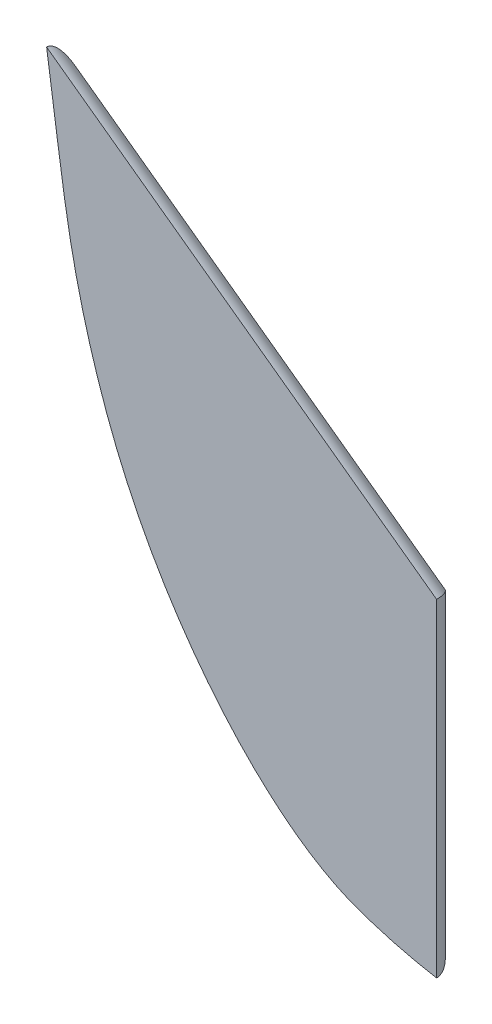
ISO-10303-21;
HEADER;
FILE_DESCRIPTION(('STEP AP214'),'2;1');
FILE_NAME('part.step','',(''),(''),'','','');
FILE_SCHEMA(('AUTOMOTIVE_DESIGN { 1 0 10303 214 1 1 1 1 }'));
ENDSEC;
DATA;
#1=APPLICATION_CONTEXT('core data for automotive mechanical design processes');
#2=APPLICATION_PROTOCOL_DEFINITION('international standard','automotive_design',2000,#1);
#3=PRODUCT_CONTEXT('',#1,'mechanical');
#4=PRODUCT('Part','Part','',(#3));
#5=PRODUCT_RELATED_PRODUCT_CATEGORY('part','',(#4));
#6=PRODUCT_DEFINITION_FORMATION('','',#4);
#7=PRODUCT_DEFINITION_CONTEXT('part definition',#1,'design');
#8=PRODUCT_DEFINITION('design','',#6,#7);
#9=PRODUCT_DEFINITION_SHAPE('','',#8);
#10=(LENGTH_UNIT() NAMED_UNIT(*) SI_UNIT(.MILLI.,.METRE.));
#11=(NAMED_UNIT(*) PLANE_ANGLE_UNIT() SI_UNIT($,.RADIAN.));
#12=(NAMED_UNIT(*) SI_UNIT($,.STERADIAN.) SOLID_ANGLE_UNIT());
#13=UNCERTAINTY_MEASURE_WITH_UNIT(LENGTH_MEASURE(1.E-05),#10,'distance_accuracy_value','');
#14=(GEOMETRIC_REPRESENTATION_CONTEXT(3) GLOBAL_UNCERTAINTY_ASSIGNED_CONTEXT((#13)) GLOBAL_UNIT_ASSIGNED_CONTEXT((#10,
#11,#12)) REPRESENTATION_CONTEXT('',''));
#15=CARTESIAN_POINT('',(0.,0.,0.));
#16=DIRECTION('',(0.,0.,1.));
#17=DIRECTION('',(1.,0.,0.));
#18=AXIS2_PLACEMENT_3D('',#15,#16,#17);
#19=CARTESIAN_POINT('',(99.1211019165311,31.0918646760635,-1.1446780770989));
#20=DIRECTION('',(-0.809093604476522,0.587679792882764,-1.52466713820014E-05));
#21=DIRECTION('',(0.587679793080542,0.809093604205054,-2.09591784259811E-05));
#22=AXIS2_PLACEMENT_3D('',#19,#20,#21);
#23=CYLINDRICAL_SURFACE('',#22,1.00000000000143);
#24=DIRECTION('',(0.80909360447652,-0.587679792883046,1.52358893724066E-05));
#25=VECTOR('',#24,1.);
#26=CARTESIAN_POINT('',(90.5043694097825,38.586522328788,-1.14487236283283));
#27=LINE('',#26,#25);
#28=CARTESIAN_POINT('',(90.5043694186448,38.5865223222092,-1.14487262210385));
#29=VERTEX_POINT('',#28);
#30=CARTESIAN_POINT('',(108.913194012544,25.2153942295418,-1.14452566456434));
#31=VERTEX_POINT('',#30);
#32=EDGE_CURVE('E123',#29,#31,#27,.T.);
#33=ORIENTED_EDGE('',*,*,#32,.T.);
#34=CARTESIAN_POINT('',(107.91319401286,24.7057866826279,-1.14451239770223));
#35=DIRECTION('',(0.454048569742273,-0.890976933360599,2.31157665532095E-05));
#36=DIRECTION('',(0.89097693366046,0.454048569589446,-1.17805531909182E-05));
#37=AXIS2_PLACEMENT_3D('',#34,#35,#36);
#38=ELLIPSE('',#37,1.12236351126315,0.9999999999999);
#39=CARTESIAN_POINT('',(107.913194012498,24.7057607407953,-2.14451239736564));
#40=VERTEX_POINT('',#39);
#41=EDGE_CURVE('E62',#40,#31,#38,.T.);
#42=ORIENTED_EDGE('',*,*,#41,.F.);
#43=DIRECTION('',(0.809093604355116,-0.587679793049911,1.52466716568837E-05));
#44=VECTOR('',#43,1.);
#45=CARTESIAN_POINT('',(91.8354484803966,36.3837249680096,-2.14481536862362));
#46=LINE('',#45,#44);
#47=CARTESIAN_POINT('',(91.83544848065,36.3837249698944,-2.14481536862367));
#48=VERTEX_POINT('',#47);
#49=EDGE_CURVE('E102',#48,#40,#46,.T.);
#50=ORIENTED_EDGE('',*,*,#49,.F.);
#51=CARTESIAN_POINT('',(90.5043694161908,38.5865223376005,-1.14487275173985));
#52=CARTESIAN_POINT('',(90.5043692216079,38.5865224613276,-1.15088716767985));
#53=CARTESIAN_POINT('',(90.5044429825826,38.5863993860834,-1.15690139457282));
#54=CARTESIAN_POINT('',(90.5047373078599,38.5859098968403,-1.16894244855512));
#55=CARTESIAN_POINT('',(90.5049585058294,38.5855424325009,-1.17496921760748));
#56=CARTESIAN_POINT('',(90.5055483362176,38.5845643637559,-1.18703216519689));
#57=CARTESIAN_POINT('',(90.5059178455513,38.5839523132912,-1.19306818310926));
#58=CARTESIAN_POINT('',(90.5068045237045,38.5824856661555,-1.2051465899937));
#59=CARTESIAN_POINT('',(90.5073227956279,38.5816292578162,-1.2111886774008));
#60=CARTESIAN_POINT('',(90.5085071918046,38.5796743424386,-1.22327614966717));
#61=CARTESIAN_POINT('',(90.5091746259914,38.5785736911196,-1.2293210584706));
#62=CARTESIAN_POINT('',(90.5106574091511,38.5761307292459,-1.24141111508601));
#63=CARTESIAN_POINT('',(90.5114742514788,38.5747859800366,-1.24745558579426));
#64=CARTESIAN_POINT('',(90.5132558113858,38.5718552106146,-1.25954170830544));
#65=CARTESIAN_POINT('',(90.5142221802556,38.5702664978973,-1.2655824623061));
#66=CARTESIAN_POINT('',(90.5163026450098,38.5668481462953,-1.27765809667602));
#67=CARTESIAN_POINT('',(90.5174185232687,38.5650156027686,-1.28369184594666));
#68=CARTESIAN_POINT('',(90.5197977517979,38.5611098872428,-1.29575041752195));
#69=CARTESIAN_POINT('',(90.5210629883509,38.5590336398418,-1.30177386948651));
#70=CARTESIAN_POINT('',(90.5237405707431,38.5546407669198,-1.313808794378));
#71=CARTESIAN_POINT('',(90.5251548800717,38.5523209351276,-1.31981865782832));
#72=CARTESIAN_POINT('',(90.5281301362006,38.547441101704,-1.33182335572874));
#73=CARTESIAN_POINT('',(90.5296930981461,38.5448778004782,-1.33781634692947));
#74=CARTESIAN_POINT('',(90.5329650795074,38.5395111801616,-1.34978425209489));
#75=CARTESIAN_POINT('',(90.5346761418844,38.5367045023447,-1.35575709873098));
#76=CARTESIAN_POINT('',(90.53824362649,38.5308512895832,-1.36768167719527));
#77=CARTESIAN_POINT('',(90.5401020975535,38.5278013685458,-1.37363113086292));
#78=CARTESIAN_POINT('',(90.5439636144256,38.521461602445,-1.38550587408155));
#79=CARTESIAN_POINT('',(90.5459686958284,38.5181683676121,-1.3914286899698));
#80=CARTESIAN_POINT('',(90.5497061711263,38.5120266464332,-1.40206280352554));
#81=CARTESIAN_POINT('',(90.5514211588238,38.509207321866,-1.40679712820868));
#82=CARTESIAN_POINT('',(90.5549495496011,38.503405683999,-1.41626372452658));
#83=CARTESIAN_POINT('',(90.5567642023538,38.5004212935521,-1.42099425411494));
#84=CARTESIAN_POINT('',(90.5624097995765,38.491135397048,-1.43531657180878));
#85=CARTESIAN_POINT('',(90.5663434396328,38.4846638249418,-1.44475840828749));
#86=CARTESIAN_POINT('',(90.5746015410464,38.4710778341788,-1.46362086922421));
#87=CARTESIAN_POINT('',(90.5789352499417,38.4639482065488,-1.47302640762684));
#88=CARTESIAN_POINT('',(90.5879944826945,38.4490456417636,-1.49180378709718));
#89=CARTESIAN_POINT('',(90.5927286885054,38.4412584714705,-1.50116011043344));
#90=CARTESIAN_POINT('',(90.6025887922051,38.4250410520085,-1.51982545906497));
#91=CARTESIAN_POINT('',(90.6077227564997,38.416597581178,-1.52911869243065));
#92=CARTESIAN_POINT('',(90.6183813114535,38.3990669245164,-1.54764364509441));
#93=CARTESIAN_POINT('',(90.6239133323206,38.3899674698522,-1.55685943852582));
#94=CARTESIAN_POINT('',(90.6353668579304,38.3711265092173,-1.57521732690553));
#95=CARTESIAN_POINT('',(90.6412951844425,38.3613737295483,-1.58434356841306));
#96=CARTESIAN_POINT('',(90.6523065129696,38.3432430047261,-1.60067721738819));
#97=CARTESIAN_POINT('',(90.6573646790606,38.3349085690495,-1.60794988044806));
#98=CARTESIAN_POINT('',(90.6677790318612,38.3177348997499,-1.62249451614789));
#99=CARTESIAN_POINT('',(90.6731391446073,38.3088886606474,-1.62975538076584));
#100=CARTESIAN_POINT('',(90.6899804857463,38.2810859573165,-1.65193291820848));
#101=CARTESIAN_POINT('',(90.7016288136324,38.2618447587122,-1.66636753814547));
#102=CARTESIAN_POINT('',(90.726131790421,38.2213792849848,-1.69516079747493));
#103=CARTESIAN_POINT('',(90.7390124680216,38.2001127127626,-1.70943715044629));
#104=CARTESIAN_POINT('',(90.7659912667313,38.1555935392642,-1.73782734423503));
#105=CARTESIAN_POINT('',(90.7801122327664,38.1323048705011,-1.75186263805415));
#106=CARTESIAN_POINT('',(90.8095717655162,38.0837399144555,-1.77967924309182));
#107=CARTESIAN_POINT('',(90.8249299601828,38.0584325826449,-1.79338523574087));
#108=CARTESIAN_POINT('',(90.856855163752,38.0058275057344,-1.82045075680933));
#109=CARTESIAN_POINT('',(90.8734386741434,37.9785026597638,-1.83373788329757));
#110=CARTESIAN_POINT('',(90.9077927163784,37.9218551044146,-1.85986966943365));
#111=CARTESIAN_POINT('',(90.9255764484074,37.8925082172821,-1.87264434590971));
#112=CARTESIAN_POINT('',(90.9602238860203,37.8352624600439,-1.89624724179841));
#113=CARTESIAN_POINT('',(90.9770765173387,37.807386205001,-1.90714696602459));
#114=CARTESIAN_POINT('',(91.0122467111553,37.7492093922776,-1.92881457394551));
#115=CARTESIAN_POINT('',(91.030576660055,37.7188882583329,-1.93950689322508));
#116=CARTESIAN_POINT('',(91.0687041970123,37.6558157564083,-1.96061841391));
#117=CARTESIAN_POINT('',(91.0885127514784,37.6230460695882,-1.97096301639536));
#118=CARTESIAN_POINT('',(91.1188219730787,37.5728897116764,-1.98592243766115));
#119=CARTESIAN_POINT('',(91.1292751364484,37.5555888499085,-1.99092514182445));
#120=CARTESIAN_POINT('',(91.1484132023592,37.523895927641,-1.99980910621663));
#121=CARTESIAN_POINT('',(91.1570938555703,37.5095139565771,-2.00373553529764));
#122=CARTESIAN_POINT('',(91.1848122093705,37.4635792201581,-2.01595674080191));
#123=CARTESIAN_POINT('',(91.2038864977664,37.431952276159,-2.02389174734893));
#124=CARTESIAN_POINT('',(91.2443344370588,37.3649121329331,-2.03978220222176));
#125=CARTESIAN_POINT('',(91.2657201477092,37.3294819635783,-2.04763496628961));
#126=CARTESIAN_POINT('',(91.3107701326659,37.2548150300006,-2.0630907156744));
#127=CARTESIAN_POINT('',(91.3344428977474,37.2155609492085,-2.07058526173735));
#128=CARTESIAN_POINT('',(91.3803964698562,37.1394038602357,-2.08399391243925));
#129=CARTESIAN_POINT('',(91.4026706612689,37.1025091077635,-2.08997797887435));
#130=CARTESIAN_POINT('',(91.4472541750461,37.0286941820197,-2.10096831807665));
#131=CARTESIAN_POINT('',(91.4695633469765,36.9917741947713,-2.10597645303085));
#132=CARTESIAN_POINT('',(91.514135210652,36.9178873426079,-2.11503372957383));
#133=CARTESIAN_POINT('',(91.5363979085042,36.8809207080701,-2.11908471514375));
#134=CARTESIAN_POINT('',(91.5697010689921,36.8253868554466,-2.12446433640061));
#135=CARTESIAN_POINT('',(91.5807789629759,36.8068750613024,-2.12614043575741));
#136=CARTESIAN_POINT('',(91.6034182398067,36.7690429169264,-2.12934109940753));
#137=CARTESIAN_POINT('',(91.61497996803,36.7497219630037,-2.1308560728075));
#138=CARTESIAN_POINT('',(91.6497018116889,36.6918166001165,-2.13505082068128));
#139=CARTESIAN_POINT('',(91.6729253964341,36.653244610044,-2.13738476358108));
#140=CARTESIAN_POINT('',(91.7193953956013,36.5761595020912,-2.14111053372992));
#141=CARTESIAN_POINT('',(91.7426417027985,36.5376463965266,-2.14250396770893));
#142=CARTESIAN_POINT('',(91.7890861787748,36.4606706824775,-2.14435648460402));
#143=CARTESIAN_POINT('',(91.8122843534173,36.4222081210595,-2.14481737569604));
#144=CARTESIAN_POINT('',(91.8354484779879,36.3837249682922,-2.14481536862363));
#145=B_SPLINE_CURVE_WITH_KNOTS('',3,(#51,#52,#53,#54,#55,#56,#57,#58,#59,#60,#61,#62,#63,#64,
#65,#66,#67,#68,#69,#70,#71,#72,#73,#74,#75,#76,#77,#78,#79,#80,#81,#82,#83,#84,#85,#86,#87,#88,
#89,#90,#91,#92,#93,#94,#95,#96,#97,#98,#99,#100,#101,#102,#103,#104,#105,#106,#107,#108,#109,
#110,#111,#112,#113,#114,#115,#116,#117,#118,#119,#120,#121,#122,#123,#124,#125,#126,#127,#128,
#129,#130,#131,#132,#133,#134,#135,#136,#137,#138,#139,#140,#141,#142,#143,#144),.UNSPECIFIED.,
.F.,.F.,(4,2,2,2,2,2,2,2,2,2,2,2,2,2,2,2,2,2,2,2,2,2,2,2,2,2,2,2,2,2,2,2,2,2,2,2,2,2,2,2,2,2,2,
2,2,2,4),(0.,0.0180412593522026,0.0361605622289745,0.0543886148749204,0.0727554874862266,
0.0912904801242545,0.110022006165877,0.128977494838637,0.148183313521076,0.167664709690576,
0.187445771720793,0.207549407194481,0.227997337014545,0.248810103362349,0.270007089449345,
0.287317691335904,0.304956618329348,0.341250602310738,0.378955145605434,0.418125131659764,
0.458808385541694,0.501046529004125,0.544875769125184,0.581359726056425,0.619267801365311,
0.699405113488106,0.785385756750849,0.877273369497321,0.975112006899408,1.07893176044885,
1.18875326253315,1.29178680264793,1.4027986681516,1.52177305412687,1.58424154891063,
1.63599480618147,1.74931245818625,1.8756675791211,2.01499676571212,2.14551750515965,
2.27578670388176,2.40580285000706,2.47071671115107,2.53841654810449,2.67365836526448,
2.80866855162921,2.94341670498576),.UNSPECIFIED.);
#146=EDGE_CURVE('E53',#29,#48,#145,.T.);
#147=ORIENTED_EDGE('',*,*,#146,.F.);
#148=EDGE_LOOP('',(#33,#42,#50,#147));
#149=FACE_BOUND('',#148,.T.);
#150=ADVANCED_FACE('F40',(#149),#23,.T.);
#151=CARTESIAN_POINT('',(108.913194021372,9.7377066438812,-1.14412405727075));
#152=CARTESIAN_POINT('',(108.913194018968,9.73768068838785,-2.14412405766128));
#153=CARTESIAN_POINT('',(109.082902786581,10.7231749476285,-2.14414962596278));
#154=CARTESIAN_POINT('',(107.52229217155,9.97605102116487,-1.14413024241453));
#155=CARTESIAN_POINT('',(107.522292196539,9.9760250948634,-2.14413024067848));
#156=CARTESIAN_POINT('',(107.748644760749,10.9519325770423,-2.14415556028423));
#157=CARTESIAN_POINT('',(106.141067616566,10.3429268633795,-1.14413975792725));
#158=CARTESIAN_POINT('',(106.141067587823,10.3429009108048,-2.14413975838911));
#159=CARTESIAN_POINT('',(106.434134771506,11.3015206628264,-2.14416462950876));
#160=CARTESIAN_POINT('',(104.813318198526,10.8492858526685,-1.14415289529653));
#161=CARTESIAN_POINT('',(104.813318198006,10.8492599081102,-2.14415289495998));
#162=CARTESIAN_POINT('',(105.168847118748,11.7839251882648,-2.14417714462275));
#163=(BOUNDED_SURFACE() B_SPLINE_SURFACE(3,2,((#151,#152,#153),(#154,#155,#156),(#157,#158,
#159),(#160,#161,#162)),.UNSPECIFIED.,.F.,.F.,.F.) B_SPLINE_SURFACE_WITH_KNOTS((4,4),(3,3),
(-2.15100214125482E-10,4.06162906152298),(0.,1.5707968455479),
.UNSPECIFIED.) GEOMETRIC_REPRESENTATION_ITEM() RATIONAL_B_SPLINE_SURFACE(((1.,0.707106775430568,
1.),(1.,0.70710679271998,1.),(1.,0.7071067740113,1.),(1.,0.707106781186547,1.))) REPRESENTATION_ITEM('') SURFACE());
#164=CARTESIAN_POINT('',(104.81331820399,10.8492858505846,-1.14415289529649));
#165=CARTESIAN_POINT('',(105.467964897037,10.5996256112041,-1.14414641831247));
#166=CARTESIAN_POINT('',(106.135986335557,10.3837306714405,-1.14414081763633));
#167=CARTESIAN_POINT('',(107.504303055998,10.0127483567425,-1.14413119337598));
#168=CARTESIAN_POINT('',(108.206432545959,9.8588170038802,-1.1441271997852));
#169=CARTESIAN_POINT('',(108.913194021151,9.73770664391905,-1.14412405799813));
#170=(BOUNDED_CURVE() B_SPLINE_CURVE(3,(#164,#165,#166,#167,#168,#169),.UNSPECIFIED.,.F.,
.F.) B_SPLINE_CURVE_WITH_KNOTS((4,2,4),(-0.425303693694747,-0.215118932663759,0.),
.UNSPECIFIED.) CURVE() GEOMETRIC_REPRESENTATION_ITEM() RATIONAL_B_SPLINE_CURVE((1.,1.,1.,1.,1.,1.)) REPRESENTATION_ITEM(''));
#171=CARTESIAN_POINT('',(104.81331820399,10.8492858505846,-1.1441528959762));
#172=VERTEX_POINT('',#171);
#173=CARTESIAN_POINT('',(108.913194021151,9.73770664391894,-1.144124062639));
#174=VERTEX_POINT('',#173);
#175=EDGE_CURVE('E95',#172,#174,#170,.T.);
#176=CARTESIAN_POINT('',(105.182976055245,11.778544676674,-2.14417700503511));
#177=CARTESIAN_POINT('',(105.182198976426,11.7765855638806,-2.14417695420639));
#178=CARTESIAN_POINT('',(105.181421885907,11.7746264615654,-2.14417024177208));
#179=CARTESIAN_POINT('',(105.1320078063,11.6500524729106,-2.14331981218334));
#180=CARTESIAN_POINT('',(105.083853550452,11.5288151635135,-2.11639579357516));
#181=CARTESIAN_POINT('',(104.995229953137,11.305908951312,-2.01477058127165));
#182=CARTESIAN_POINT('',(104.955425109926,11.2059024278563,-1.94223076755866));
#183=CARTESIAN_POINT('',(104.888127817882,11.0369232056897,-1.76037255233305));
#184=CARTESIAN_POINT('',(104.861263333888,10.9695248965142,-1.65275066880614));
#185=CARTESIAN_POINT('',(104.832723245454,10.8979395375417,-1.47090780192564));
#186=CARTESIAN_POINT('',(104.825220006444,10.8791245274295,-1.40486305380765));
#187=CARTESIAN_POINT('',(104.815653745348,10.8551386003257,-1.27365493574079));
#188=CARTESIAN_POINT('',(104.813318198509,10.8492841707837,-1.20898058281759));
#189=CARTESIAN_POINT('',(104.813318203991,10.8492858505845,-1.1441528959762));
#190=(BOUNDED_CURVE() B_SPLINE_CURVE(3,(#176,#177,#178,#179,#180,#181,#182,#183,#184,#185,#186,
#187,#188,#189),.UNSPECIFIED.,.F.,.F.) B_SPLINE_CURVE_WITH_KNOTS((4,2,2,2,2,2,4),
(-0.000632279762993861,-2.29710998486676E-13,0.0395734882497302,0.0781550843022495,
0.11673566486896,0.137404969258704,0.156853346402828),
.UNSPECIFIED.) CURVE() GEOMETRIC_REPRESENTATION_ITEM() RATIONAL_B_SPLINE_CURVE((1.,1.,1.,1.,1.,
1.,1.,1.,1.,1.,1.,1.,1.,1.)) REPRESENTATION_ITEM(''));
#191=CARTESIAN_POINT('',(105.182976055325,11.7785446766424,-2.14417700503511));
#192=VERTEX_POINT('',#191);
#193=EDGE_CURVE('E11',#192,#172,#190,.T.);
#194=CARTESIAN_POINT('',(118.175855001984,30.8717173955088,-2.14467237572699));
#195=DIRECTION('',(-5.20289346750426E-10,-2.59445582435729E-05,-0.99999999966344));
#196=DIRECTION('',(0.875935116079785,0.482428929751961,-1.25168612102563E-05));
#197=AXIS2_PLACEMENT_3D('',#194,#195,#196);
#198=ELLIPSE('',#197,24.6338901061068,19.0512551201942);
#199=CARTESIAN_POINT('',(107.913194019176,10.9562942088306,-2.14415567353045));
#200=VERTEX_POINT('',#199);
#201=EDGE_CURVE('E93',#200,#192,#198,.T.);
#202=CARTESIAN_POINT('',(107.913194019956,10.9562942088311,-2.14415567353045));
#203=CARTESIAN_POINT('',(107.932511487924,10.9321207746246,-2.1441544648952));
#204=CARTESIAN_POINT('',(107.951839919379,10.9079520747105,-2.14359684109354));
#205=CARTESIAN_POINT('',(107.995399566519,10.8535481225183,-2.14106933651271));
#206=CARTESIAN_POINT('',(108.019631590559,10.8233280823886,-2.13877729221883));
#207=CARTESIAN_POINT('',(108.057839662758,10.7757797828755,-2.13373915638867));
#208=CARTESIAN_POINT('',(108.071826756548,10.7583949271184,-2.13159323341062));
#209=CARTESIAN_POINT('',(108.101505347671,10.7215418105442,-2.12638711380894));
#210=CARTESIAN_POINT('',(108.117193434227,10.7020821271663,-2.12324660998183));
#211=CARTESIAN_POINT('',(108.157931553454,10.651605336856,-2.11405516167426));
#212=CARTESIAN_POINT('',(108.18294468171,10.6206671890615,-2.10738911175624));
#213=CARTESIAN_POINT('',(108.22433759686,10.5697317646215,-2.09463866680104));
#214=CARTESIAN_POINT('',(108.240745810383,10.5496095996661,-2.08913434854991));
#215=CARTESIAN_POINT('',(108.283511535334,10.4970989325054,-2.07348281790427));
#216=CARTESIAN_POINT('',(108.309740132485,10.464828257885,-2.0625708077218));
#217=CARTESIAN_POINT('',(108.359955302958,10.4031896406913,-2.03904849340204));
#218=CARTESIAN_POINT('',(108.383969448296,10.3737775936327,-2.02661243851425));
#219=CARTESIAN_POINT('',(108.429706887761,10.3179632972606,-2.00050504904018));
#220=CARTESIAN_POINT('',(108.451461987417,10.2915060722579,-1.98700741518512));
#221=CARTESIAN_POINT('',(108.492633035429,10.2416276606299,-1.95923238789677));
#222=CARTESIAN_POINT('',(108.512087228193,10.2181432413911,-1.94512628372632));
#223=CARTESIAN_POINT('',(108.54016274788,10.1843112115553,-1.92315269659473));
#224=CARTESIAN_POINT('',(108.548997157396,10.1736743224145,-1.91599768138786));
#225=CARTESIAN_POINT('',(108.566057466508,10.1531234651432,-1.90166666363199));
#226=CARTESIAN_POINT('',(108.574290841202,10.1432010119547,-1.89451177674268));
#227=CARTESIAN_POINT('',(108.592695057571,10.1210016416025,-1.87794466361501));
#228=CARTESIAN_POINT('',(108.602823354416,10.1087710078653,-1.86842281599053));
#229=CARTESIAN_POINT('',(108.622581191189,10.0849222612838,-1.84903216485508));
#230=CARTESIAN_POINT('',(108.632216845312,10.0732964966726,-1.839179007971));
#231=CARTESIAN_POINT('',(108.650982666034,10.0506683669208,-1.81915893381463));
#232=CARTESIAN_POINT('',(108.660119456036,10.0396576452908,-1.80900769162995));
#233=CARTESIAN_POINT('',(108.67788550855,10.0182698222165,-1.78842813398599));
#234=CARTESIAN_POINT('',(108.686521819036,10.0078836152422,-1.77801538291647));
#235=CARTESIAN_POINT('',(108.703283167177,9.98775130678619,-1.75694891868537));
#236=CARTESIAN_POINT('',(108.711415763084,9.97799539377344,-1.74631061454084));
#237=CARTESIAN_POINT('',(108.727165921975,9.95912729709446,-1.72482920803771));
#238=CARTESIAN_POINT('',(108.73479159579,9.95000462352737,-1.7140012853412));
#239=CARTESIAN_POINT('',(108.749523740869,9.93240367012077,-1.69217629270504));
#240=CARTESIAN_POINT('',(108.756638929543,9.92391426187413,-1.6811941018593));
#241=CARTESIAN_POINT('',(108.770345701615,9.90757774989675,-1.65909553472052));
#242=CARTESIAN_POINT('',(108.776946656765,9.8997189243227,-1.64799365717585));
#243=CARTESIAN_POINT('',(108.789620248046,9.88463885549018,-1.62568957848595));
#244=CARTESIAN_POINT('',(108.795702956587,9.87740535143083,-1.61450141404028));
#245=CARTESIAN_POINT('',(108.807335417295,9.86356889239783,-1.59205783041407));
#246=CARTESIAN_POINT('',(108.812895969352,9.85695319732235,-1.58081587962889));
#247=CARTESIAN_POINT('',(108.824515426278,9.84310702622123,-1.55608807673598));
#248=CARTESIAN_POINT('',(108.830510897999,9.83594850805268,-1.54253186238278));
#249=CARTESIAN_POINT('',(108.841866773455,9.8223759513038,-1.51515244409316));
#250=CARTESIAN_POINT('',(108.847236976848,9.81595047049548,-1.50133901190881));
#251=CARTESIAN_POINT('',(108.85484974403,9.80684105854815,-1.48035880796732));
#252=CARTESIAN_POINT('',(108.857297958561,9.8039114147899,-1.4733718194121));
#253=CARTESIAN_POINT('',(108.862036746391,9.79824179786995,-1.45934890984751));
#254=CARTESIAN_POINT('',(108.864328544655,9.79550034955058,-1.45231400211217));
#255=CARTESIAN_POINT('',(108.868754305618,9.79020844765197,-1.43820112389852));
#256=CARTESIAN_POINT('',(108.870889489828,9.78765651342576,-1.43112409148252));
#257=CARTESIAN_POINT('',(108.875001928826,9.78274454592741,-1.41693255059863));
#258=CARTESIAN_POINT('',(108.876980397912,9.78038303392109,-1.40981890639642));
#259=CARTESIAN_POINT('',(108.880779261637,9.77585260843081,-1.39555984482678));
#260=CARTESIAN_POINT('',(108.882600860671,9.77368222393698,-1.38841521604963));
#261=CARTESIAN_POINT('',(108.886085829027,9.76953448619894,-1.37409987937845));
#262=CARTESIAN_POINT('',(108.887750389501,9.76755567622133,-1.36692988391143));
#263=CARTESIAN_POINT('',(108.890921105389,9.76379127071897,-1.35256951265805));
#264=CARTESIAN_POINT('',(108.892428435162,9.76200423938544,-1.34537977288535));
#265=CARTESIAN_POINT('',(108.895284497922,9.75862332257683,-1.33098559365097));
#266=CARTESIAN_POINT('',(108.896634384601,9.75702802907945,-1.32378171413867));
#267=CARTESIAN_POINT('',(108.899175353297,9.75403027125498,-1.30936490485944));
#268=CARTESIAN_POINT('',(108.900367564172,9.75262643367799,-1.30215245989483));
#269=CARTESIAN_POINT('',(108.902592958511,9.75001102623013,-1.28772412268688));
#270=CARTESIAN_POINT('',(108.903627241544,9.74879812494603,-1.28050864165186));
#271=CARTESIAN_POINT('',(108.905536543549,9.74656378880098,-1.26607977443446));
#272=CARTESIAN_POINT('',(108.906412628076,9.74554107143579,-1.25886672809498));
#273=CARTESIAN_POINT('',(108.908005284068,9.74368606665058,-1.24444819801739));
#274=CARTESIAN_POINT('',(108.908722882108,9.74285255265108,-1.23724298569665));
#275=CARTESIAN_POINT('',(108.909998303599,9.74137469283433,-1.22284550182504));
#276=CARTESIAN_POINT('',(108.910557109476,9.74072918321133,-1.21565343696289));
#277=CARTESIAN_POINT('',(108.911514678921,9.73962583973031,-1.20128753009809));
#278=CARTESIAN_POINT('',(108.911914375401,9.73916691153506,-1.19411383448084));
#279=CARTESIAN_POINT('',(108.912553434496,9.7384350628969,-1.17978981611182));
#280=CARTESIAN_POINT('',(108.912793675141,9.73816112368126,-1.17263958478442));
#281=CARTESIAN_POINT('',(108.913113578219,9.73779724460752,-1.15836758906793));
#282=CARTESIAN_POINT('',(108.913194058005,9.73770636814822,-1.15124586678906));
#283=CARTESIAN_POINT('',(108.913194021372,9.7377066438812,-1.14412405727075));
#284=B_SPLINE_CURVE_WITH_KNOTS('',3,(#202,#203,#204,#205,#206,#207,#208,#209,#210,#211,#212,
#213,#214,#215,#216,#217,#218,#219,#220,#221,#222,#223,#224,#225,#226,#227,#228,#229,#230,#231,
#232,#233,#234,#235,#236,#237,#238,#239,#240,#241,#242,#243,#244,#245,#246,#247,#248,#249,#250,
#251,#252,#253,#254,#255,#256,#257,#258,#259,#260,#261,#262,#263,#264,#265,#266,#267,#268,#269,
#270,#271,#272,#273,#274,#275,#276,#277,#278,#279,#280,#281,#282,#283),.UNSPECIFIED.,.F.,.F.,(4,
2,2,2,2,2,2,2,2,2,2,2,2,2,2,2,2,2,2,2,2,2,2,2,2,2,2,2,2,2,2,2,2,2,2,2,2,2,2,2,4),(0.,
0.0928330264072487,0.209198446794629,0.276438944780753,0.352005482271528,0.472962676730505,
0.552573348841038,0.681467191337242,0.801262708052898,0.911650624520709,1.0123894735296,
1.05908989833555,1.10332090555655,1.15885470591025,1.21293219454507,1.26554827394913,
1.3167005969607,1.366389945963,1.41462062737852,1.46140088430053,1.50674333040568,
1.55066540826401,1.59318987464463,1.64254538322262,1.69097548614991,1.7148586938239,
1.73852600592075,1.76198302106104,1.78523558605605,1.80828981122094,1.83115208526037,
1.85382908955391,1.87632781165924,1.89865555784313,1.92081996444412,1.94282900786687,
1.96469101300733,1.98641465990981,2.00800898846313,2.02948340095271,2.05084766230045),.UNSPECIFIED.);
#285=EDGE_CURVE('E86',#200,#174,#284,.T.);
#286=ORIENTED_EDGE('',*,*,#175,.F.);
#287=ORIENTED_EDGE('',*,*,#193,.F.);
#288=ORIENTED_EDGE('',*,*,#201,.F.);
#289=ORIENTED_EDGE('',*,*,#285,.T.);
#290=EDGE_LOOP('',(#286,#287,#288,#289));
#291=FACE_BOUND('',#290,.T.);
#292=ADVANCED_FACE('F91',(#291),#163,.T.);
#293=CARTESIAN_POINT('',(104.81331820399,10.8492858505847,-1.14415289529648));
#294=CARTESIAN_POINT('',(104.81331820236,10.849259903312,-2.14415289495986));
#295=CARTESIAN_POINT('',(105.191910610434,11.7748234008487,-2.1441769084929));
#296=CARTESIAN_POINT('',(103.327459900411,11.4719940797723,-1.14416905466906));
#297=CARTESIAN_POINT('',(103.327459878531,11.471968193643,-2.14416905007549));
#298=CARTESIAN_POINT('',(103.863000623863,12.3275179811439,-2.14419124721821));
#299=CARTESIAN_POINT('',(101.385655134641,12.8795212874829,-1.14420556053179));
#300=CARTESIAN_POINT('',(101.38565516241,12.879495257316,-2.14420556674131));
#301=CARTESIAN_POINT('',(102.037621525694,13.6436860386231,-2.14422539366731));
#302=CARTESIAN_POINT('',(99.221879241242,15.065054984803,-1.14426227435154));
#303=CARTESIAN_POINT('',(99.2218792216351,15.0650291086211,-2.14426226831536));
#304=CARTESIAN_POINT('',(99.9685749726045,15.7315182381129,-2.14427956047492));
#305=CARTESIAN_POINT('',(96.8661530263353,17.9502566109314,-1.14433711191742));
#306=CARTESIAN_POINT('',(96.866153049462,17.9502305524352,-2.14433712238121));
#307=CARTESIAN_POINT('',(97.6947332343818,18.5184087340416,-2.14435186393466));
#308=CARTESIAN_POINT('',(94.4432216795709,21.9565999942104,-1.14444108878025));
#309=CARTESIAN_POINT('',(94.4432216549783,21.9565742590401,-2.14444106390671));
#310=CARTESIAN_POINT('',(95.348179624593,22.3917643376128,-2.1444523552138));
#311=CARTESIAN_POINT('',(92.654537928309,26.807599307972,-1.14456691695808));
#312=CARTESIAN_POINT('',(92.654537927959,26.8075733426977,-2.14456692002961));
#313=CARTESIAN_POINT('',(93.6147238740239,27.0976063864455,-2.144574445305));
#314=CARTESIAN_POINT('',(91.621404420421,30.9756182595015,-1.14467503962731));
#315=CARTESIAN_POINT('',(91.6214044123688,30.9755922447328,-2.14467505691271));
#316=CARTESIAN_POINT('',(92.601985979105,31.1747199320116,-2.14468022368792));
#317=CARTESIAN_POINT('',(91.0400524494444,34.8035871731455,-1.14477443054812));
#318=CARTESIAN_POINT('',(91.0400524913809,34.8035613491595,-2.14477437151259));
#319=CARTESIAN_POINT('',(92.0357913630652,34.9127708704187,-2.14477720547361));
#320=CARTESIAN_POINT('',(90.7003521557165,37.3001698864996,-1.14483899382072));
#321=CARTESIAN_POINT('',(90.7003520201366,37.3001438220829,-2.14483914424625));
#322=CARTESIAN_POINT('',(91.6870792481654,37.4596037979188,-2.14484328174739));
#323=CARTESIAN_POINT('',(90.5043694161908,38.5865223376005,-1.14487275173985));
#324=CARTESIAN_POINT('',(90.5043696486511,38.586496427049,-2.14487251764929));
#325=CARTESIAN_POINT('',(91.4938876957945,38.7309040683078,-2.14487626497078));
#326=(BOUNDED_SURFACE() B_SPLINE_SURFACE(3,2,((#293,#294,#295),(#296,#297,#298),(#299,#300,
#301),(#302,#303,#304),(#305,#306,#307),(#308,#309,#310),(#311,#312,#313),(#314,#315,#316),
(#317,#318,#319),(#320,#321,#322),(#323,#324,#325)),.UNSPECIFIED.,.F.,.F.,
.F.) B_SPLINE_SURFACE_WITH_KNOTS((4,1,1,1,1,1,1,1,4),(3,3),(0.,4.29502219701395,
6.69041736340815,8.80628104943283,15.0828820953557,20.1911319445034,23.8134798469919,
27.6704431947823,31.5274065425727),(0.,1.57079633301488),
.UNSPECIFIED.) GEOMETRIC_REPRESENTATION_ITEM() RATIONAL_B_SPLINE_SURFACE(((1.,0.707106779631252,
1.),(1.,0.707106782933791,1.),(1.,0.707106778706583,1.),(1.,0.707106783251152,1.),(1.,
0.707106777309695,1.),(1.,0.707106789964296,1.),(1.,0.707106779956387,1.),(1.,0.707106774915102,
1.),(1.,0.707106802096302,1.),(1.,0.707106727439866,1.),(1.,0.707106864729571,1.))) REPRESENTATION_ITEM('') SURFACE());
#327=CARTESIAN_POINT('',(90.5043694185388,38.5865223221897,-1.14487275173944));
#328=CARTESIAN_POINT('',(90.700352157073,37.3001698765297,-1.14483899382046));
#329=CARTESIAN_POINT('',(91.0400524502343,34.8035871679445,-1.14477443054798));
#330=CARTESIAN_POINT('',(91.621404420421,30.9756182595015,-1.14467503962731));
#331=CARTESIAN_POINT('',(92.654537928309,26.807599307972,-1.14456691695808));
#332=CARTESIAN_POINT('',(94.4432216795709,21.9565999942104,-1.14444108878025));
#333=CARTESIAN_POINT('',(96.8661530263353,17.9502566109314,-1.14433711191742));
#334=CARTESIAN_POINT('',(99.221879241242,15.065054984803,-1.14426227435154));
#335=CARTESIAN_POINT('',(101.385655134641,12.8795212874829,-1.14420556053179));
#336=CARTESIAN_POINT('',(103.327459900411,11.4719940797723,-1.14416905466906));
#337=CARTESIAN_POINT('',(104.81331820399,10.8492858505847,-1.14415289529648));
#338=(BOUNDED_CURVE() B_SPLINE_CURVE(3,(#327,#328,#329,#330,#331,#332,#333,#334,#335,#336,#337),
.UNSPECIFIED.,.F.,.F.) B_SPLINE_CURVE_WITH_KNOTS((4,1,1,1,1,1,1,1,4),(-31.5274065271702,
-27.6704431947823,-23.8134798469919,-20.1911319445034,-15.0828820953557,-8.80628104943283,
-6.69041736340815,-4.29502219701395,0.),
.UNSPECIFIED.) CURVE() GEOMETRIC_REPRESENTATION_ITEM() RATIONAL_B_SPLINE_CURVE((1.,1.,1.,1.,1.,
1.,1.,1.,1.,1.,1.)) REPRESENTATION_ITEM(''));
#339=EDGE_CURVE('E107',#29,#172,#338,.T.);
#340=CARTESIAN_POINT('',(105.182976055324,11.7785446766413,-2.14417700503511));
#341=CARTESIAN_POINT('',(103.857747434566,12.3313066689685,-2.14419134551131));
#342=CARTESIAN_POINT('',(102.035359412643,13.6459686902438,-2.14422545288852));
#343=CARTESIAN_POINT('',(99.9685749726045,15.7315182381129,-2.14427956047492));
#344=CARTESIAN_POINT('',(97.6947332343818,18.5184087340416,-2.14435186393466));
#345=CARTESIAN_POINT('',(95.348179624593,22.3917643376128,-2.1444523552138));
#346=CARTESIAN_POINT('',(93.6147238740239,27.0976063864455,-2.144574445305));
#347=CARTESIAN_POINT('',(92.601985979105,31.1747199320116,-2.14468022368792));
#348=CARTESIAN_POINT('',(92.154258830977,34.1306415158585,-2.14475691353465));
#349=CARTESIAN_POINT('',(91.9049858388213,35.8936673073708,-2.14480265433029));
#350=CARTESIAN_POINT('',(91.835448483681,36.383724973526,-2.14481536862377));
#351=(BOUNDED_CURVE() B_SPLINE_CURVE(3,(#340,#341,#342,#343,#344,#345,#346,#347,#348,#349,#350),
.UNSPECIFIED.,.F.,.F.) B_SPLINE_CURVE_WITH_KNOTS((4,1,1,1,1,1,1,1,4),(0.00962801115675204,
4.29502219701395,6.69041736340815,8.80628104943283,15.0828820953557,20.1911319445034,
23.8134798469919,27.6704431947823,29.1554663842924),
.UNSPECIFIED.) CURVE() GEOMETRIC_REPRESENTATION_ITEM() RATIONAL_B_SPLINE_CURVE((1.,1.,1.,1.,1.,
1.,1.,1.,1.,1.,1.)) REPRESENTATION_ITEM(''));
#352=EDGE_CURVE('E98',#192,#48,#351,.T.);
#353=ORIENTED_EDGE('',*,*,#339,.F.);
#354=ORIENTED_EDGE('',*,*,#146,.T.);
#355=ORIENTED_EDGE('',*,*,#352,.F.);
#356=ORIENTED_EDGE('',*,*,#193,.T.);
#357=EDGE_LOOP('',(#353,#354,#355,#356));
#358=FACE_BOUND('',#357,.T.);
#359=ADVANCED_FACE('F42',(#358),#326,.T.);
#360=CARTESIAN_POINT('',(107.913194016865,17.476550440056,-1.14432483836151));
#361=DIRECTION('',(5.53899410827404E-10,-0.99999999966344,2.59445582306862E-05));
#362=DIRECTION('',(-5.20365972533961E-10,-2.59445582306865E-05,-0.99999999966344));
#363=AXIS2_PLACEMENT_3D('',#360,#361,#362);
#364=CYLINDRICAL_SURFACE('',#363,0.9999999999999);
#365=DIRECTION('',(-5.66647518697356E-10,0.99999999966344,-2.59445582298796E-05));
#366=VECTOR('',#365,1.);
#367=CARTESIAN_POINT('',(107.913194019176,10.9562942088306,-2.14415567353045));
#368=LINE('',#367,#366);
#369=EDGE_CURVE('E105',#200,#40,#368,.T.);
#370=ORIENTED_EDGE('',*,*,#369,.T.);
#371=ORIENTED_EDGE('',*,*,#41,.T.);
#372=DIRECTION('',(-5.53898706657267E-10,0.999999999663454,-2.5944004070581E-05));
#373=VECTOR('',#372,1.);
#374=CARTESIAN_POINT('',(108.913194021151,9.73770664453481,-1.1441240665728));
#375=LINE('',#374,#373);
#376=EDGE_CURVE('E118',#174,#31,#375,.T.);
#377=ORIENTED_EDGE('',*,*,#376,.F.);
#378=ORIENTED_EDGE('',*,*,#285,.F.);
#379=EDGE_LOOP('',(#370,#371,#377,#378));
#380=FACE_BOUND('',#379,.T.);
#381=ADVANCED_FACE('F161',(#380),#364,.T.);
#382=CARTESIAN_POINT('',(83.4160170765182,61.6063518281539,-2.14546975415462));
#383=DIRECTION('',(-5.2028532899658E-10,-2.59445582298355E-05,-0.99999999966344));
#384=DIRECTION('',(0.,-0.99999999966344,2.59445582298355E-05));
#385=AXIS2_PLACEMENT_3D('',#382,#383,#384);
#386=PLANE('',#385);
#387=ORIENTED_EDGE('',*,*,#201,.T.);
#388=ORIENTED_EDGE('',*,*,#352,.T.);
#389=ORIENTED_EDGE('',*,*,#49,.T.);
#390=ORIENTED_EDGE('',*,*,#369,.F.);
#391=EDGE_LOOP('',(#387,#388,#389,#390));
#392=FACE_BOUND('',#391,.T.);
#393=ADVANCED_FACE('F104',(#392),#386,.T.);
#394=CARTESIAN_POINT('',(114.930716170699,9.42839326819983,-1.14411603613007));
#395=DIRECTION('',(5.20285328992924E-10,2.59445582298369E-05,0.99999999966344));
#396=DIRECTION('',(0.999999999798924,-2.00537362894838E-05,0.));
#397=AXIS2_PLACEMENT_3D('',#394,#395,#396);
#398=PLANE('',#397);
#399=ORIENTED_EDGE('',*,*,#376,.T.);
#400=ORIENTED_EDGE('',*,*,#32,.F.);
#401=ORIENTED_EDGE('',*,*,#339,.T.);
#402=ORIENTED_EDGE('',*,*,#175,.T.);
#403=EDGE_LOOP('',(#399,#400,#401,#402));
#404=FACE_BOUND('',#403,.T.);
#405=ADVANCED_FACE('F170',(#404),#398,.T.);
#406=CLOSED_SHELL('',(#150,#292,#359,#381,#393,#405));
#407=MANIFOLD_SOLID_BREP('B2',#406);
#408=ADVANCED_BREP_SHAPE_REPRESENTATION('',(#18,#407),#14);
#409=SHAPE_DEFINITION_REPRESENTATION(#9,#408);
ENDSEC;
END-ISO-10303-21;
